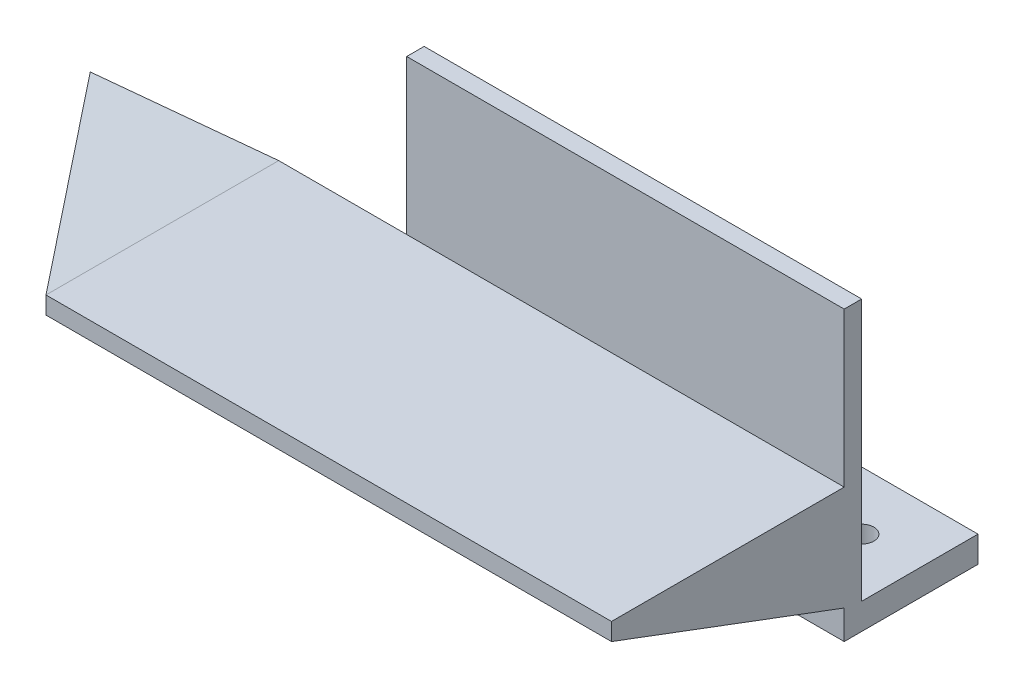
ISO-10303-21;
HEADER;
FILE_DESCRIPTION(('STEP AP214'),'2;1');
FILE_NAME('part.step','',(''),(''),'','','');
FILE_SCHEMA(('AUTOMOTIVE_DESIGN { 1 0 10303 214 1 1 1 1 }'));
ENDSEC;
DATA;
#1=APPLICATION_CONTEXT('core data for automotive mechanical design processes');
#2=APPLICATION_PROTOCOL_DEFINITION('international standard','automotive_design',2000,#1);
#3=PRODUCT_CONTEXT('',#1,'mechanical');
#4=PRODUCT('Part','Part','',(#3));
#5=PRODUCT_RELATED_PRODUCT_CATEGORY('part','',(#4));
#6=PRODUCT_DEFINITION_FORMATION('','',#4);
#7=PRODUCT_DEFINITION_CONTEXT('part definition',#1,'design');
#8=PRODUCT_DEFINITION('design','',#6,#7);
#9=PRODUCT_DEFINITION_SHAPE('','',#8);
#10=(LENGTH_UNIT() NAMED_UNIT(*) SI_UNIT(.MILLI.,.METRE.));
#11=(NAMED_UNIT(*) PLANE_ANGLE_UNIT() SI_UNIT($,.RADIAN.));
#12=(NAMED_UNIT(*) SI_UNIT($,.STERADIAN.) SOLID_ANGLE_UNIT());
#13=UNCERTAINTY_MEASURE_WITH_UNIT(LENGTH_MEASURE(1.E-05),#10,'distance_accuracy_value','');
#14=(GEOMETRIC_REPRESENTATION_CONTEXT(3) GLOBAL_UNCERTAINTY_ASSIGNED_CONTEXT((#13)) GLOBAL_UNIT_ASSIGNED_CONTEXT((#10,
#11,#12)) REPRESENTATION_CONTEXT('',''));
#15=CARTESIAN_POINT('',(0.,0.,0.));
#16=DIRECTION('',(0.,0.,1.));
#17=DIRECTION('',(1.,0.,0.));
#18=AXIS2_PLACEMENT_3D('',#15,#16,#17);
#19=CARTESIAN_POINT('',(-38.6021406727829,4.5,0.));
#20=DIRECTION('',(1.,0.,0.));
#21=DIRECTION('',(0.,0.,-1.));
#22=AXIS2_PLACEMENT_3D('',#19,#20,#21);
#23=PLANE('',#22);
#24=DIRECTION('',(0.,-1.,0.));
#25=VECTOR('',#24,1.);
#26=CARTESIAN_POINT('',(-38.6021406727829,23.,3.56162079510703));
#27=LINE('',#26,#25);
#28=CARTESIAN_POINT('',(-38.6021406727829,23.,3.56162079510703));
#29=VERTEX_POINT('',#28);
#30=CARTESIAN_POINT('',(-38.6021406727829,5.,3.56162079510703));
#31=VERTEX_POINT('',#30);
#32=EDGE_CURVE('E365',#29,#31,#27,.T.);
#33=ORIENTED_EDGE('',*,*,#32,.F.);
#34=DIRECTION('',(0.,-1.,0.));
#35=VECTOR('',#34,1.);
#36=CARTESIAN_POINT('',(-38.6021406727829,2.,3.56162079510703));
#37=LINE('',#36,#35);
#38=CARTESIAN_POINT('',(-38.6021406727829,49.5,3.56162079510703));
#39=VERTEX_POINT('',#38);
#40=EDGE_CURVE('E329',#39,#29,#37,.T.);
#41=ORIENTED_EDGE('',*,*,#40,.F.);
#42=DIRECTION('',(0.,0.,-1.));
#43=VECTOR('',#42,1.);
#44=CARTESIAN_POINT('',(-38.6021406727829,49.5,3.56162079510703));
#45=LINE('',#44,#43);
#46=CARTESIAN_POINT('',(-38.6021406727829,49.5,0.561620795107031));
#47=VERTEX_POINT('',#46);
#48=EDGE_CURVE('E335',#39,#47,#45,.T.);
#49=ORIENTED_EDGE('',*,*,#48,.T.);
#50=DIRECTION('',(0.,-1.,0.));
#51=VECTOR('',#50,1.);
#52=CARTESIAN_POINT('',(-38.6021406727829,2.,0.561620795107031));
#53=LINE('',#52,#51);
#54=CARTESIAN_POINT('',(-38.6021406727829,4.5,0.561620795107031));
#55=VERTEX_POINT('',#54);
#56=EDGE_CURVE('E316',#47,#55,#53,.T.);
#57=ORIENTED_EDGE('',*,*,#56,.T.);
#58=DIRECTION('',(0.,0.,1.));
#59=VECTOR('',#58,1.);
#60=CARTESIAN_POINT('',(-38.6021406727829,4.5,0.));
#61=LINE('',#60,#59);
#62=CARTESIAN_POINT('',(-38.6021406727829,4.5,-19.438379204893));
#63=VERTEX_POINT('',#62);
#64=EDGE_CURVE('E174',#63,#55,#61,.T.);
#65=ORIENTED_EDGE('',*,*,#64,.F.);
#66=DIRECTION('',(0.,-1.,0.));
#67=VECTOR('',#66,1.);
#68=CARTESIAN_POINT('',(-38.6021406727829,4.5,-19.438379204893));
#69=LINE('',#68,#67);
#70=CARTESIAN_POINT('',(-38.6021406727829,2.,-19.438379204893));
#71=VERTEX_POINT('',#70);
#72=EDGE_CURVE('E165',#63,#71,#69,.T.);
#73=ORIENTED_EDGE('',*,*,#72,.T.);
#74=DIRECTION('',(0.,0.,1.));
#75=VECTOR('',#74,1.);
#76=CARTESIAN_POINT('',(-38.6021406727829,2.,0.));
#77=LINE('',#76,#75);
#78=CARTESIAN_POINT('',(-38.6021406727829,2.,3.56162079510703));
#79=VERTEX_POINT('',#78);
#80=EDGE_CURVE('E147',#71,#79,#77,.T.);
#81=ORIENTED_EDGE('',*,*,#80,.T.);
#82=EDGE_CURVE('E328',#31,#79,#37,.T.);
#83=ORIENTED_EDGE('',*,*,#82,.F.);
#84=EDGE_LOOP('',(#33,#41,#49,#57,#65,#73,#81,#83));
#85=FACE_BOUND('',#84,.T.);
#86=ADVANCED_FACE('F43',(#85),#23,.F.);
#87=CARTESIAN_POINT('',(0.,0.,3.56162079510703));
#88=DIRECTION('',(0.,0.,-1.));
#89=DIRECTION('',(-1.,0.,0.));
#90=AXIS2_PLACEMENT_3D('',#87,#88,#89);
#91=PLANE('',#90);
#92=DIRECTION('',(1.,0.,0.));
#93=VECTOR('',#92,1.);
#94=CARTESIAN_POINT('',(0.,5.,3.56162079510703));
#95=LINE('',#94,#93);
#96=CARTESIAN_POINT('',(36.5978593272171,5.,3.56162079510703));
#97=VERTEX_POINT('',#96);
#98=EDGE_CURVE('E356',#31,#97,#95,.T.);
#99=ORIENTED_EDGE('',*,*,#98,.F.);
#100=ORIENTED_EDGE('',*,*,#82,.T.);
#101=DIRECTION('',(-1.,0.,0.));
#102=VECTOR('',#101,1.);
#103=CARTESIAN_POINT('',(-53.6021406727829,2.,3.56162079510703));
#104=LINE('',#103,#102);
#105=CARTESIAN_POINT('',(-53.6021406727829,2.,3.56162079510703));
#106=VERTEX_POINT('',#105);
#107=EDGE_CURVE('E154',#79,#106,#104,.T.);
#108=ORIENTED_EDGE('',*,*,#107,.T.);
#109=DIRECTION('',(0.,-1.,0.));
#110=VECTOR('',#109,1.);
#111=CARTESIAN_POINT('',(-53.6021406727829,0.,3.56162079510703));
#112=LINE('',#111,#110);
#113=CARTESIAN_POINT('',(-53.6021406727829,0.,3.56162079510703));
#114=VERTEX_POINT('',#113);
#115=EDGE_CURVE('E333',#106,#114,#112,.T.);
#116=ORIENTED_EDGE('',*,*,#115,.T.);
#117=DIRECTION('',(1.,0.,0.));
#118=VECTOR('',#117,1.);
#119=CARTESIAN_POINT('',(36.5978593272171,0.,3.56162079510703));
#120=LINE('',#119,#118);
#121=CARTESIAN_POINT('',(36.5978593272171,0.,3.56162079510703));
#122=VERTEX_POINT('',#121);
#123=EDGE_CURVE('E313',#114,#122,#120,.T.);
#124=ORIENTED_EDGE('',*,*,#123,.T.);
#125=DIRECTION('',(0.,1.,0.));
#126=VECTOR('',#125,1.);
#127=CARTESIAN_POINT('',(36.5978593272171,49.5,3.56162079510703));
#128=LINE('',#127,#126);
#129=EDGE_CURVE('E318',#122,#97,#128,.T.);
#130=ORIENTED_EDGE('',*,*,#129,.T.);
#131=EDGE_LOOP('',(#99,#100,#108,#116,#124,#130));
#132=FACE_BOUND('',#131,.T.);
#133=ADVANCED_FACE('F247',(#132),#91,.F.);
#134=DIRECTION('',(-1.,0.,0.));
#135=VECTOR('',#134,1.);
#136=CARTESIAN_POINT('',(0.,23.,3.56162079510703));
#137=LINE('',#136,#135);
#138=CARTESIAN_POINT('',(36.5978593272171,23.,3.56162079510703));
#139=VERTEX_POINT('',#138);
#140=EDGE_CURVE('E349',#139,#29,#137,.T.);
#141=ORIENTED_EDGE('',*,*,#140,.F.);
#142=CARTESIAN_POINT('',(36.5978593272171,49.5,3.56162079510703));
#143=VERTEX_POINT('',#142);
#144=EDGE_CURVE('E315',#139,#143,#128,.T.);
#145=ORIENTED_EDGE('',*,*,#144,.T.);
#146=DIRECTION('',(-1.,0.,0.));
#147=VECTOR('',#146,1.);
#148=CARTESIAN_POINT('',(-38.6021406727829,49.5,3.56162079510703));
#149=LINE('',#148,#147);
#150=EDGE_CURVE('E326',#143,#39,#149,.T.);
#151=ORIENTED_EDGE('',*,*,#150,.T.);
#152=ORIENTED_EDGE('',*,*,#40,.T.);
#153=EDGE_LOOP('',(#141,#145,#151,#152));
#154=FACE_BOUND('',#153,.T.);
#155=ADVANCED_FACE('F250',(#154),#91,.F.);
#156=CARTESIAN_POINT('',(36.5978593272171,2.,0.));
#157=DIRECTION('',(-1.,0.,0.));
#158=DIRECTION('',(0.,0.,1.));
#159=AXIS2_PLACEMENT_3D('',#156,#157,#158);
#160=PLANE('',#159);
#161=DIRECTION('',(0.,1.,0.));
#162=VECTOR('',#161,1.);
#163=CARTESIAN_POINT('',(36.5978593272171,0.,43.561620795107));
#164=LINE('',#163,#162);
#165=CARTESIAN_POINT('',(36.5978593272171,20.,43.561620795107));
#166=VERTEX_POINT('',#165);
#167=CARTESIAN_POINT('',(36.5978593272171,23.,43.561620795107));
#168=VERTEX_POINT('',#167);
#169=EDGE_CURVE('E353',#166,#168,#164,.T.);
#170=ORIENTED_EDGE('',*,*,#169,.F.);
#171=DIRECTION('',(0.,0.351123441588392,0.936329177569045));
#172=VECTOR('',#171,1.);
#173=CARTESIAN_POINT('',(36.5978593272171,3.21261782078673,-1.20473168279502));
#174=LINE('',#173,#172);
#175=EDGE_CURVE('E61',#97,#166,#174,.T.);
#176=ORIENTED_EDGE('',*,*,#175,.F.);
#177=ORIENTED_EDGE('',*,*,#129,.F.);
#178=DIRECTION('',(0.,0.,-1.));
#179=VECTOR('',#178,1.);
#180=CARTESIAN_POINT('',(36.5978593272171,0.,0.));
#181=LINE('',#180,#179);
#182=CARTESIAN_POINT('',(36.5978593272171,0.,-19.438379204893));
#183=VERTEX_POINT('',#182);
#184=EDGE_CURVE('E192',#122,#183,#181,.T.);
#185=ORIENTED_EDGE('',*,*,#184,.T.);
#186=DIRECTION('',(0.,-1.,0.));
#187=VECTOR('',#186,1.);
#188=CARTESIAN_POINT('',(36.5978593272171,2.,-19.438379204893));
#189=LINE('',#188,#187);
#190=CARTESIAN_POINT('',(36.5978593272171,4.5,-19.438379204893));
#191=VERTEX_POINT('',#190);
#192=EDGE_CURVE('E53',#191,#183,#189,.T.);
#193=ORIENTED_EDGE('',*,*,#192,.F.);
#194=DIRECTION('',(0.,0.,-1.));
#195=VECTOR('',#194,1.);
#196=CARTESIAN_POINT('',(36.5978593272171,4.5,0.));
#197=LINE('',#196,#195);
#198=CARTESIAN_POINT('',(36.5978593272171,4.5,0.561620795107031));
#199=VERTEX_POINT('',#198);
#200=EDGE_CURVE('E177',#199,#191,#197,.T.);
#201=ORIENTED_EDGE('',*,*,#200,.F.);
#202=DIRECTION('',(0.,1.,0.));
#203=VECTOR('',#202,1.);
#204=CARTESIAN_POINT('',(36.5978593272171,49.5,0.561620795107031));
#205=LINE('',#204,#203);
#206=CARTESIAN_POINT('',(36.5978593272171,49.5,0.561620795107031));
#207=VERTEX_POINT('',#206);
#208=EDGE_CURVE('E304',#199,#207,#205,.T.);
#209=ORIENTED_EDGE('',*,*,#208,.T.);
#210=DIRECTION('',(0.,0.,-1.));
#211=VECTOR('',#210,1.);
#212=CARTESIAN_POINT('',(36.5978593272171,49.5,3.56162079510703));
#213=LINE('',#212,#211);
#214=EDGE_CURVE('E159',#143,#207,#213,.T.);
#215=ORIENTED_EDGE('',*,*,#214,.F.);
#216=ORIENTED_EDGE('',*,*,#144,.F.);
#217=DIRECTION('',(0.,0.,-1.));
#218=VECTOR('',#217,1.);
#219=CARTESIAN_POINT('',(36.5978593272171,23.,43.561620795107));
#220=LINE('',#219,#218);
#221=EDGE_CURVE('E323',#168,#139,#220,.T.);
#222=ORIENTED_EDGE('',*,*,#221,.F.);
#223=EDGE_LOOP('',(#170,#176,#177,#185,#193,#201,#209,#215,#216,#222));
#224=FACE_BOUND('',#223,.T.);
#225=ADVANCED_FACE('F278',(#224),#160,.F.);
#226=CARTESIAN_POINT('',(0.,2.,-19.438379204893));
#227=DIRECTION('',(0.,0.,1.));
#228=DIRECTION('',(1.,0.,0.));
#229=AXIS2_PLACEMENT_3D('',#226,#227,#228);
#230=PLANE('',#229);
#231=DIRECTION('',(-1.,0.,0.));
#232=VECTOR('',#231,1.);
#233=CARTESIAN_POINT('',(0.,0.,-19.438379204893));
#234=LINE('',#233,#232);
#235=CARTESIAN_POINT('',(-53.6021406727829,0.,-19.438379204893));
#236=VERTEX_POINT('',#235);
#237=EDGE_CURVE('E195',#183,#236,#234,.T.);
#238=ORIENTED_EDGE('',*,*,#237,.T.);
#239=DIRECTION('',(0.,-1.,0.));
#240=VECTOR('',#239,1.);
#241=CARTESIAN_POINT('',(-53.6021406727829,2.,-19.438379204893));
#242=LINE('',#241,#240);
#243=CARTESIAN_POINT('',(-53.6021406727829,2.,-19.438379204893));
#244=VERTEX_POINT('',#243);
#245=EDGE_CURVE('E167',#244,#236,#242,.T.);
#246=ORIENTED_EDGE('',*,*,#245,.F.);
#247=DIRECTION('',(-1.,0.,0.));
#248=VECTOR('',#247,1.);
#249=CARTESIAN_POINT('',(0.,2.,-19.438379204893));
#250=LINE('',#249,#248);
#251=EDGE_CURVE('E151',#71,#244,#250,.T.);
#252=ORIENTED_EDGE('',*,*,#251,.F.);
#253=ORIENTED_EDGE('',*,*,#72,.F.);
#254=DIRECTION('',(-1.,0.,0.));
#255=VECTOR('',#254,1.);
#256=CARTESIAN_POINT('',(0.,4.5,-19.438379204893));
#257=LINE('',#256,#255);
#258=EDGE_CURVE('E291',#191,#63,#257,.T.);
#259=ORIENTED_EDGE('',*,*,#258,.F.);
#260=ORIENTED_EDGE('',*,*,#192,.T.);
#261=EDGE_LOOP('',(#238,#246,#252,#253,#259,#260));
#262=FACE_BOUND('',#261,.T.);
#263=ADVANCED_FACE('F163',(#262),#230,.F.);
#264=CARTESIAN_POINT('',(-53.6021406727829,2.,0.));
#265=DIRECTION('',(1.,0.,0.));
#266=DIRECTION('',(0.,0.,-1.));
#267=AXIS2_PLACEMENT_3D('',#264,#265,#266);
#268=PLANE('',#267);
#269=DIRECTION('',(0.,0.,1.));
#270=VECTOR('',#269,1.);
#271=CARTESIAN_POINT('',(-53.6021406727829,0.,0.));
#272=LINE('',#271,#270);
#273=EDGE_CURVE('E187',#236,#114,#272,.T.);
#274=ORIENTED_EDGE('',*,*,#273,.T.);
#275=ORIENTED_EDGE('',*,*,#115,.F.);
#276=DIRECTION('',(0.,0.,1.));
#277=VECTOR('',#276,1.);
#278=CARTESIAN_POINT('',(-53.6021406727829,2.,0.));
#279=LINE('',#278,#277);
#280=EDGE_CURVE('E169',#244,#106,#279,.T.);
#281=ORIENTED_EDGE('',*,*,#280,.F.);
#282=ORIENTED_EDGE('',*,*,#245,.T.);
#283=EDGE_LOOP('',(#274,#275,#281,#282));
#284=FACE_BOUND('',#283,.T.);
#285=ADVANCED_FACE('F271',(#284),#268,.F.);
#286=CARTESIAN_POINT('',(26.5978593272171,2.,-9.43837920489297));
#287=DIRECTION('',(0.,-1.,0.));
#288=DIRECTION('',(0.,0.,-1.));
#289=AXIS2_PLACEMENT_3D('',#286,#287,#288);
#290=CYLINDRICAL_SURFACE('',#289,2.1);
#291=CARTESIAN_POINT('',(26.5978593272171,0.,-9.43837920489297));
#292=DIRECTION('',(0.,1.,0.));
#293=DIRECTION('',(0.,0.,1.));
#294=AXIS2_PLACEMENT_3D('',#291,#292,#293);
#295=CIRCLE('',#294,2.1);
#296=CARTESIAN_POINT('',(26.5978593272171,0.,-7.33837920489297));
#297=VERTEX_POINT('',#296);
#298=EDGE_CURVE('E180',#297,#297,#295,.T.);
#299=ORIENTED_EDGE('',*,*,#298,.F.);
#300=EDGE_LOOP('',(#299));
#301=FACE_BOUND('',#300,.T.);
#302=CARTESIAN_POINT('',(26.5978593272171,4.5,-9.43837920489297));
#303=DIRECTION('',(0.,1.,0.));
#304=DIRECTION('',(0.,0.,1.));
#305=AXIS2_PLACEMENT_3D('',#302,#303,#304);
#306=CIRCLE('',#305,2.1);
#307=CARTESIAN_POINT('',(26.5978593272171,4.5,-7.33837920489297));
#308=VERTEX_POINT('',#307);
#309=EDGE_CURVE('E158',#308,#308,#306,.F.);
#310=ORIENTED_EDGE('',*,*,#309,.F.);
#311=EDGE_LOOP('',(#310));
#312=FACE_BOUND('',#311,.T.);
#313=ADVANCED_FACE('F274',(#301,#312),#290,.F.);
#314=CARTESIAN_POINT('',(-43.6021406727829,2.,-9.43837920489296));
#315=DIRECTION('',(0.,-1.,0.));
#316=DIRECTION('',(0.,0.,-1.));
#317=AXIS2_PLACEMENT_3D('',#314,#315,#316);
#318=CYLINDRICAL_SURFACE('',#317,2.1);
#319=CARTESIAN_POINT('',(-43.6021406727829,2.,-9.43837920489296));
#320=DIRECTION('',(0.,1.,0.));
#321=DIRECTION('',(0.,0.,1.));
#322=AXIS2_PLACEMENT_3D('',#319,#320,#321);
#323=CIRCLE('',#322,2.1);
#324=CARTESIAN_POINT('',(-43.6021406727829,2.,-7.33837920489296));
#325=VERTEX_POINT('',#324);
#326=EDGE_CURVE('E170',#325,#325,#323,.T.);
#327=ORIENTED_EDGE('',*,*,#326,.T.);
#328=EDGE_LOOP('',(#327));
#329=FACE_BOUND('',#328,.T.);
#330=CARTESIAN_POINT('',(-43.6021406727829,0.,-9.43837920489296));
#331=DIRECTION('',(0.,1.,0.));
#332=DIRECTION('',(0.,0.,1.));
#333=AXIS2_PLACEMENT_3D('',#330,#331,#332);
#334=CIRCLE('',#333,2.1);
#335=CARTESIAN_POINT('',(-43.6021406727829,0.,-7.33837920489296));
#336=VERTEX_POINT('',#335);
#337=EDGE_CURVE('E176',#336,#336,#334,.T.);
#338=ORIENTED_EDGE('',*,*,#337,.F.);
#339=EDGE_LOOP('',(#338));
#340=FACE_BOUND('',#339,.T.);
#341=ADVANCED_FACE('F45',(#329,#340),#318,.F.);
#342=CARTESIAN_POINT('',(0.,2.,0.));
#343=DIRECTION('',(0.,1.,0.));
#344=DIRECTION('',(0.,0.,1.));
#345=AXIS2_PLACEMENT_3D('',#342,#343,#344);
#346=PLANE('',#345);
#347=ORIENTED_EDGE('',*,*,#80,.F.);
#348=ORIENTED_EDGE('',*,*,#251,.T.);
#349=ORIENTED_EDGE('',*,*,#280,.T.);
#350=ORIENTED_EDGE('',*,*,#107,.F.);
#351=EDGE_LOOP('',(#347,#348,#349,#350));
#352=FACE_BOUND('',#351,.T.);
#353=ORIENTED_EDGE('',*,*,#326,.F.);
#354=EDGE_LOOP('',(#353));
#355=FACE_BOUND('',#354,.T.);
#356=ADVANCED_FACE('F149',(#352,#355),#346,.T.);
#357=CARTESIAN_POINT('',(0.,0.,0.));
#358=DIRECTION('',(0.,1.,0.));
#359=DIRECTION('',(0.,0.,1.));
#360=AXIS2_PLACEMENT_3D('',#357,#358,#359);
#361=PLANE('',#360);
#362=ORIENTED_EDGE('',*,*,#337,.T.);
#363=EDGE_LOOP('',(#362));
#364=FACE_BOUND('',#363,.T.);
#365=ORIENTED_EDGE('',*,*,#298,.T.);
#366=EDGE_LOOP('',(#365));
#367=FACE_BOUND('',#366,.T.);
#368=ORIENTED_EDGE('',*,*,#184,.F.);
#369=ORIENTED_EDGE('',*,*,#123,.F.);
#370=ORIENTED_EDGE('',*,*,#273,.F.);
#371=ORIENTED_EDGE('',*,*,#237,.F.);
#372=EDGE_LOOP('',(#368,#369,#370,#371));
#373=FACE_BOUND('',#372,.T.);
#374=ADVANCED_FACE('F262',(#364,#367,#373),#361,.F.);
#375=CARTESIAN_POINT('',(0.,4.5,0.));
#376=DIRECTION('',(0.,1.,0.));
#377=DIRECTION('',(0.,0.,1.));
#378=AXIS2_PLACEMENT_3D('',#375,#376,#377);
#379=PLANE('',#378);
#380=ORIENTED_EDGE('',*,*,#309,.T.);
#381=EDGE_LOOP('',(#380));
#382=FACE_BOUND('',#381,.T.);
#383=ORIENTED_EDGE('',*,*,#258,.T.);
#384=ORIENTED_EDGE('',*,*,#64,.T.);
#385=DIRECTION('',(1.,0.,0.));
#386=VECTOR('',#385,1.);
#387=CARTESIAN_POINT('',(0.,4.5,0.561620795107031));
#388=LINE('',#387,#386);
#389=EDGE_CURVE('E183',#55,#199,#388,.T.);
#390=ORIENTED_EDGE('',*,*,#389,.T.);
#391=ORIENTED_EDGE('',*,*,#200,.T.);
#392=EDGE_LOOP('',(#383,#384,#390,#391));
#393=FACE_BOUND('',#392,.T.);
#394=ADVANCED_FACE('F255',(#382,#393),#379,.T.);
#395=CARTESIAN_POINT('',(0.,0.,0.561620795107031));
#396=DIRECTION('',(0.,0.,-1.));
#397=DIRECTION('',(-1.,0.,0.));
#398=AXIS2_PLACEMENT_3D('',#395,#396,#397);
#399=PLANE('',#398);
#400=ORIENTED_EDGE('',*,*,#389,.F.);
#401=ORIENTED_EDGE('',*,*,#56,.F.);
#402=DIRECTION('',(-1.,0.,0.));
#403=VECTOR('',#402,1.);
#404=CARTESIAN_POINT('',(-38.6021406727829,49.5,0.561620795107031));
#405=LINE('',#404,#403);
#406=EDGE_CURVE('E320',#207,#47,#405,.T.);
#407=ORIENTED_EDGE('',*,*,#406,.F.);
#408=ORIENTED_EDGE('',*,*,#208,.F.);
#409=EDGE_LOOP('',(#400,#401,#407,#408));
#410=FACE_BOUND('',#409,.T.);
#411=ADVANCED_FACE('F252',(#410),#399,.T.);
#412=CARTESIAN_POINT('',(-38.6021406727829,49.5,3.56162079510703));
#413=DIRECTION('',(0.,-1.,0.));
#414=DIRECTION('',(0.,0.,-1.));
#415=AXIS2_PLACEMENT_3D('',#412,#413,#414);
#416=PLANE('',#415);
#417=ORIENTED_EDGE('',*,*,#406,.T.);
#418=ORIENTED_EDGE('',*,*,#48,.F.);
#419=ORIENTED_EDGE('',*,*,#150,.F.);
#420=ORIENTED_EDGE('',*,*,#214,.T.);
#421=EDGE_LOOP('',(#417,#418,#419,#420));
#422=FACE_BOUND('',#421,.T.);
#423=ADVANCED_FACE('F245',(#422),#416,.F.);
#424=CARTESIAN_POINT('',(0.,23.,43.561620795107));
#425=DIRECTION('',(0.,-1.,0.));
#426=DIRECTION('',(0.,0.,-1.));
#427=AXIS2_PLACEMENT_3D('',#424,#425,#426);
#428=PLANE('',#427);
#429=ORIENTED_EDGE('',*,*,#140,.T.);
#430=DIRECTION('',(1.,0.,0.));
#431=VECTOR('',#430,1.);
#432=CARTESIAN_POINT('',(-60.6021406727829,23.,3.56162079510703));
#433=LINE('',#432,#431);
#434=CARTESIAN_POINT('',(-60.6021406727827,23.,3.56162079510703));
#435=VERTEX_POINT('',#434);
#436=EDGE_CURVE('E206',#435,#29,#433,.T.);
#437=ORIENTED_EDGE('',*,*,#436,.F.);
#438=DIRECTION('',(0.,0.,1.));
#439=VECTOR('',#438,1.);
#440=CARTESIAN_POINT('',(-60.6021406727829,23.,0.));
#441=LINE('',#440,#439);
#442=CARTESIAN_POINT('',(-60.6021406727829,23.,43.561620795107));
#443=VERTEX_POINT('',#442);
#444=EDGE_CURVE('E75',#443,#435,#441,.F.);
#445=ORIENTED_EDGE('',*,*,#444,.F.);
#446=DIRECTION('',(-1.,0.,0.));
#447=VECTOR('',#446,1.);
#448=CARTESIAN_POINT('',(0.,23.,43.561620795107));
#449=LINE('',#448,#447);
#450=EDGE_CURVE('E352',#168,#443,#449,.T.);
#451=ORIENTED_EDGE('',*,*,#450,.F.);
#452=ORIENTED_EDGE('',*,*,#221,.T.);
#453=EDGE_LOOP('',(#429,#437,#445,#451,#452));
#454=FACE_BOUND('',#453,.T.);
#455=ADVANCED_FACE('F241',(#454),#428,.F.);
#456=CARTESIAN_POINT('',(0.,0.,43.561620795107));
#457=DIRECTION('',(0.,0.,1.));
#458=DIRECTION('',(1.,0.,0.));
#459=AXIS2_PLACEMENT_3D('',#456,#457,#458);
#460=PLANE('',#459);
#461=DIRECTION('',(-1.,0.,0.));
#462=VECTOR('',#461,1.);
#463=CARTESIAN_POINT('',(0.,20.,43.561620795107));
#464=LINE('',#463,#462);
#465=CARTESIAN_POINT('',(-60.6021001727829,20.,43.561670795107));
#466=VERTEX_POINT('',#465);
#467=EDGE_CURVE('E12',#166,#466,#464,.T.);
#468=ORIENTED_EDGE('',*,*,#467,.F.);
#469=ORIENTED_EDGE('',*,*,#169,.T.);
#470=ORIENTED_EDGE('',*,*,#450,.T.);
#471=DIRECTION('',(0.,1.,0.));
#472=VECTOR('',#471,1.);
#473=CARTESIAN_POINT('',(-60.6021406727829,0.,43.561620795107));
#474=LINE('',#473,#472);
#475=EDGE_CURVE('E207',#466,#443,#474,.T.);
#476=ORIENTED_EDGE('',*,*,#475,.F.);
#477=EDGE_LOOP('',(#468,#469,#470,#476));
#478=FACE_BOUND('',#477,.T.);
#479=ADVANCED_FACE('F238',(#478),#460,.T.);
#480=CARTESIAN_POINT('',(-53.6021406727829,3.21261782078673,-1.20473168279502));
#481=DIRECTION('',(0.,0.936329177569044,-0.351123441588392));
#482=DIRECTION('',(0.,0.351123441588392,0.936329177569045));
#483=AXIS2_PLACEMENT_3D('',#480,#481,#482);
#484=PLANE('',#483);
#485=ORIENTED_EDGE('',*,*,#98,.T.);
#486=ORIENTED_EDGE('',*,*,#175,.T.);
#487=ORIENTED_EDGE('',*,*,#467,.T.);
#488=DIRECTION('',(0.,-0.351123441588392,-0.936329177569045));
#489=VECTOR('',#488,1.);
#490=CARTESIAN_POINT('',(-60.6021406727829,20.,43.561620795107));
#491=LINE('',#490,#489);
#492=CARTESIAN_POINT('',(-60.6021406727829,5.,3.56162079510703));
#493=VERTEX_POINT('',#492);
#494=EDGE_CURVE('E220',#493,#466,#491,.F.);
#495=ORIENTED_EDGE('',*,*,#494,.F.);
#496=DIRECTION('',(1.,0.,0.));
#497=VECTOR('',#496,1.);
#498=CARTESIAN_POINT('',(-60.6021406727829,5.,3.56162079510703));
#499=LINE('',#498,#497);
#500=EDGE_CURVE('E203',#493,#31,#499,.T.);
#501=ORIENTED_EDGE('',*,*,#500,.T.);
#502=EDGE_LOOP('',(#485,#486,#487,#495,#501));
#503=FACE_BOUND('',#502,.T.);
#504=ADVANCED_FACE('F233',(#503),#484,.F.);
#505=CARTESIAN_POINT('',(-60.6021406727829,23.,3.56162079510703));
#506=DIRECTION('',(0.,0.,1.));
#507=DIRECTION('',(1.,0.,0.));
#508=AXIS2_PLACEMENT_3D('',#505,#506,#507);
#509=PLANE('',#508);
#510=ORIENTED_EDGE('',*,*,#32,.T.);
#511=ORIENTED_EDGE('',*,*,#500,.F.);
#512=DIRECTION('',(-0.907466907119841,0.420123568111038,0.));
#513=VECTOR('',#512,1.);
#514=CARTESIAN_POINT('',(-93.0021406727829,20.,3.56162079510703));
#515=LINE('',#514,#513);
#516=CARTESIAN_POINT('',(-93.0021507977829,20.,3.56160829510703));
#517=VERTEX_POINT('',#516);
#518=EDGE_CURVE('E214',#493,#517,#515,.T.);
#519=ORIENTED_EDGE('',*,*,#518,.T.);
#520=DIRECTION('',(0.99574067405595,0.0921982105607363,0.));
#521=VECTOR('',#520,1.);
#522=CARTESIAN_POINT('',(-93.0021406727829,20.,3.56162079510703));
#523=LINE('',#522,#521);
#524=EDGE_CURVE('E382',#517,#435,#523,.T.);
#525=ORIENTED_EDGE('',*,*,#524,.T.);
#526=ORIENTED_EDGE('',*,*,#436,.T.);
#527=EDGE_LOOP('',(#510,#511,#519,#525,#526));
#528=FACE_BOUND('',#527,.T.);
#529=ADVANCED_FACE('F222',(#528),#509,.F.);
#530=CARTESIAN_POINT('',(-8.33431727491333,-18.0021253138128,6.7507969926798));
#531=DIRECTION('',(0.397725154168529,0.859086333004022,-0.322157374876508));
#532=DIRECTION('',(-0.907466907119841,0.420123568111038,0.));
#533=AXIS2_PLACEMENT_3D('',#530,#531,#532);
#534=PLANE('',#533);
#535=CARTESIAN_POINT('',(-93.0021406727829,20.,3.56162079510703));
#536=DIRECTION('',(0.629421741569466,0.,0.777063878480823));
#537=VECTOR('',#536,1.);
#538=LINE('',#535,#537);
#539=EDGE_CURVE('E369',#517,#466,#538,.T.);
#540=ORIENTED_EDGE('',*,*,#539,.F.);
#541=ORIENTED_EDGE('',*,*,#518,.F.);
#542=ORIENTED_EDGE('',*,*,#494,.T.);
#543=EDGE_LOOP('',(#540,#541,#542));
#544=FACE_BOUND('',#543,.T.);
#545=ADVANCED_FACE('F232',(#544),#534,.F.);
#546=CARTESIAN_POINT('',(-57.8993137593259,0.,46.8984441450539));
#547=DIRECTION('',(-0.777063878480823,0.,0.629421741569467));
#548=DIRECTION('',(0.629421741569467,0.,0.777063878480823));
#549=AXIS2_PLACEMENT_3D('',#546,#547,#548);
#550=PLANE('',#549);
#551=ORIENTED_EDGE('',*,*,#539,.T.);
#552=ORIENTED_EDGE('',*,*,#475,.T.);
#553=DIRECTION('',(0.628355530687271,0.0581810676562289,0.775747568749718));
#554=VECTOR('',#553,1.);
#555=CARTESIAN_POINT('',(-93.0021406727829,20.,3.56162079510703));
#556=LINE('',#555,#554);
#557=EDGE_CURVE('E86',#517,#443,#556,.T.);
#558=ORIENTED_EDGE('',*,*,#557,.F.);
#559=EDGE_LOOP('',(#551,#552,#558));
#560=FACE_BOUND('',#559,.T.);
#561=ADVANCED_FACE('F384',(#560),#550,.T.);
#562=CARTESIAN_POINT('',(-2.62667579626644,28.3680985996775,0.));
#563=DIRECTION('',(-0.0921982105607363,0.99574067405595,0.));
#564=DIRECTION('',(-0.99574067405595,-0.0921982105607363,0.));
#565=AXIS2_PLACEMENT_3D('',#562,#563,#564);
#566=PLANE('',#565);
#567=ORIENTED_EDGE('',*,*,#557,.T.);
#568=ORIENTED_EDGE('',*,*,#444,.T.);
#569=ORIENTED_EDGE('',*,*,#524,.F.);
#570=EDGE_LOOP('',(#567,#568,#569));
#571=FACE_BOUND('',#570,.T.);
#572=ADVANCED_FACE('F386',(#571),#566,.T.);
#573=CLOSED_SHELL('',(#86,#133,#155,#225,#263,#285,#313,#341,#356,#374,#394,#411,#423,#455,#479,
#504,#529,#545,#561,#572));
#574=MANIFOLD_SOLID_BREP('B2',#573);
#575=ADVANCED_BREP_SHAPE_REPRESENTATION('',(#18,#574),#14);
#576=SHAPE_DEFINITION_REPRESENTATION(#9,#575);
ENDSEC;
END-ISO-10303-21;
